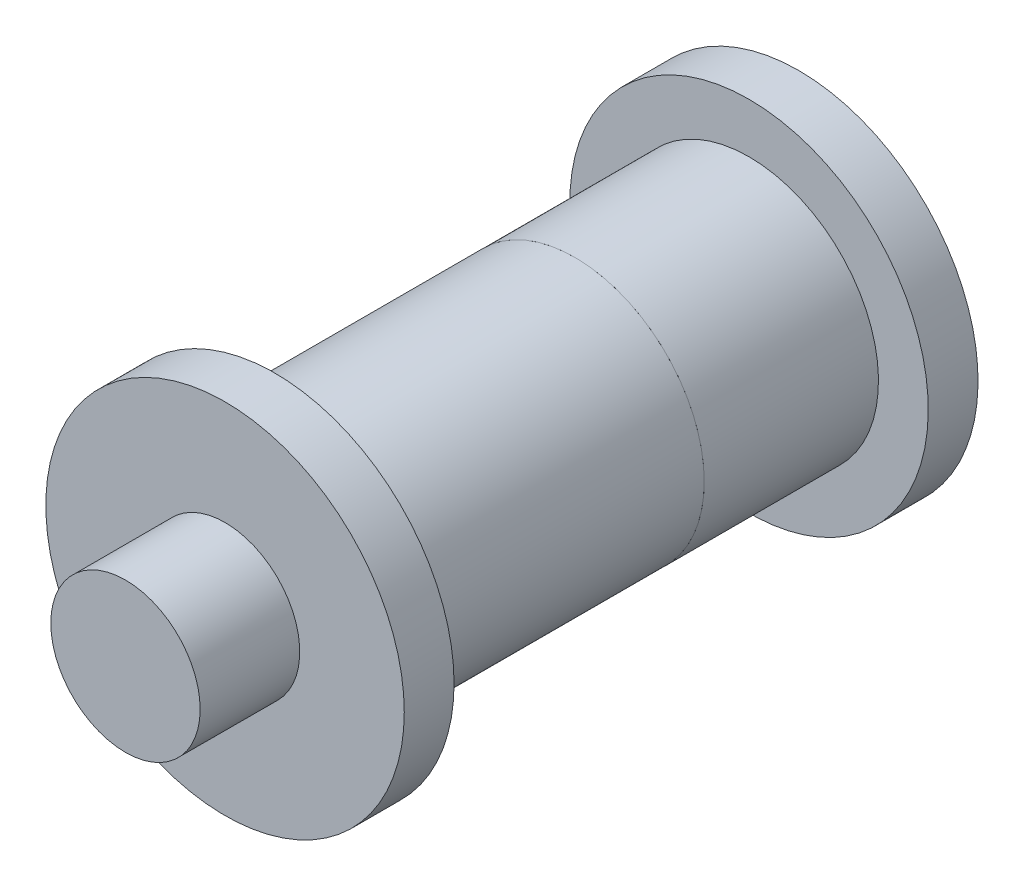
ISO-10303-21;
HEADER;
FILE_DESCRIPTION(('STEP AP214'),'2;1');
FILE_NAME('part.step','',(''),(''),'','','');
FILE_SCHEMA(('AUTOMOTIVE_DESIGN { 1 0 10303 214 1 1 1 1 }'));
ENDSEC;
DATA;
#1=APPLICATION_CONTEXT('core data for automotive mechanical design processes');
#2=APPLICATION_PROTOCOL_DEFINITION('international standard','automotive_design',2000,#1);
#3=PRODUCT_CONTEXT('',#1,'mechanical');
#4=PRODUCT('Part','Part','',(#3));
#5=PRODUCT_RELATED_PRODUCT_CATEGORY('part','',(#4));
#6=PRODUCT_DEFINITION_FORMATION('','',#4);
#7=PRODUCT_DEFINITION_CONTEXT('part definition',#1,'design');
#8=PRODUCT_DEFINITION('design','',#6,#7);
#9=PRODUCT_DEFINITION_SHAPE('','',#8);
#10=(LENGTH_UNIT() NAMED_UNIT(*) SI_UNIT(.MILLI.,.METRE.));
#11=(NAMED_UNIT(*) PLANE_ANGLE_UNIT() SI_UNIT($,.RADIAN.));
#12=(NAMED_UNIT(*) SI_UNIT($,.STERADIAN.) SOLID_ANGLE_UNIT());
#13=UNCERTAINTY_MEASURE_WITH_UNIT(LENGTH_MEASURE(1.E-05),#10,'distance_accuracy_value','');
#14=(GEOMETRIC_REPRESENTATION_CONTEXT(3) GLOBAL_UNCERTAINTY_ASSIGNED_CONTEXT((#13)) GLOBAL_UNIT_ASSIGNED_CONTEXT((#10,
#11,#12)) REPRESENTATION_CONTEXT('',''));
#15=CARTESIAN_POINT('',(0.,0.,0.));
#16=DIRECTION('',(0.,0.,1.));
#17=DIRECTION('',(1.,0.,0.));
#18=AXIS2_PLACEMENT_3D('',#15,#16,#17);
#19=CARTESIAN_POINT('',(0.,0.,0.));
#20=DIRECTION('',(0.,0.,1.));
#21=DIRECTION('',(1.,0.,0.));
#22=AXIS2_PLACEMENT_3D('',#19,#20,#21);
#23=PLANE('',#22);
#24=DIRECTION('',(-1.,0.,0.));
#25=VECTOR('',#24,1.);
#26=CARTESIAN_POINT('',(0.,1.1,0.));
#27=LINE('',#26,#25);
#28=CARTESIAN_POINT('',(1.16189500386223,1.1,0.));
#29=VERTEX_POINT('',#28);
#30=CARTESIAN_POINT('',(-1.16189500386223,1.1,0.));
#31=VERTEX_POINT('',#30);
#32=EDGE_CURVE('E75',#29,#31,#27,.T.);
#33=ORIENTED_EDGE('',*,*,#32,.T.);
#34=CARTESIAN_POINT('',(0.,0.,0.));
#35=DIRECTION('',(0.,0.,1.));
#36=DIRECTION('',(1.,0.,0.));
#37=AXIS2_PLACEMENT_3D('',#34,#35,#36);
#38=CIRCLE('',#37,1.6);
#39=EDGE_CURVE('E104',#31,#29,#38,.T.);
#40=ORIENTED_EDGE('',*,*,#39,.T.);
#41=EDGE_LOOP('',(#33,#40));
#42=FACE_BOUND('',#41,.T.);
#43=CARTESIAN_POINT('',(0.,0.,0.));
#44=DIRECTION('',(0.,0.,1.));
#45=DIRECTION('',(1.,0.,0.));
#46=AXIS2_PLACEMENT_3D('',#43,#44,#45);
#47=CIRCLE('',#46,5.2);
#48=CARTESIAN_POINT('',(5.2,0.,0.));
#49=VERTEX_POINT('',#48);
#50=EDGE_CURVE('E63',#49,#49,#47,.T.);
#51=ORIENTED_EDGE('',*,*,#50,.F.);
#52=EDGE_LOOP('',(#51));
#53=FACE_BOUND('',#52,.T.);
#54=ADVANCED_FACE('F55',(#42,#53),#23,.F.);
#55=CARTESIAN_POINT('',(0.,0.,14.05));
#56=DIRECTION('',(0.,0.,1.));
#57=DIRECTION('',(1.,0.,0.));
#58=AXIS2_PLACEMENT_3D('',#55,#56,#57);
#59=CYLINDRICAL_SURFACE('',#58,5.2);
#60=CARTESIAN_POINT('',(0.,0.,12.05));
#61=DIRECTION('',(0.,0.,1.));
#62=DIRECTION('',(1.,0.,0.));
#63=AXIS2_PLACEMENT_3D('',#60,#61,#62);
#64=CIRCLE('',#63,5.2);
#65=CARTESIAN_POINT('',(5.2,0.,12.05));
#66=VERTEX_POINT('',#65);
#67=EDGE_CURVE('E115',#66,#66,#64,.T.);
#68=ORIENTED_EDGE('',*,*,#67,.F.);
#69=EDGE_LOOP('',(#68));
#70=FACE_BOUND('',#69,.T.);
#71=ORIENTED_EDGE('',*,*,#50,.T.);
#72=EDGE_LOOP('',(#71));
#73=FACE_BOUND('',#72,.T.);
#74=ADVANCED_FACE('F122',(#70,#73),#59,.T.);
#75=CARTESIAN_POINT('',(0.,5.2,12.05));
#76=DIRECTION('',(0.,0.,1.));
#77=DIRECTION('',(1.,0.,0.));
#78=AXIS2_PLACEMENT_3D('',#75,#76,#77);
#79=PLANE('',#78);
#80=CARTESIAN_POINT('',(0.,0.,12.05));
#81=DIRECTION('',(0.,0.,1.));
#82=DIRECTION('',(1.,0.,0.));
#83=AXIS2_PLACEMENT_3D('',#80,#81,#82);
#84=CIRCLE('',#83,7.2);
#85=CARTESIAN_POINT('',(7.2,0.,12.05));
#86=VERTEX_POINT('',#85);
#87=EDGE_CURVE('E111',#86,#86,#84,.T.);
#88=ORIENTED_EDGE('',*,*,#87,.F.);
#89=EDGE_LOOP('',(#88));
#90=FACE_BOUND('',#89,.T.);
#91=ORIENTED_EDGE('',*,*,#67,.T.);
#92=EDGE_LOOP('',(#91));
#93=FACE_BOUND('',#92,.T.);
#94=ADVANCED_FACE('F129',(#90,#93),#79,.F.);
#95=CARTESIAN_POINT('',(0.,0.,14.05));
#96=DIRECTION('',(0.,0.,1.));
#97=DIRECTION('',(1.,0.,0.));
#98=AXIS2_PLACEMENT_3D('',#95,#96,#97);
#99=CYLINDRICAL_SURFACE('',#98,7.2);
#100=CARTESIAN_POINT('',(0.,0.,14.05));
#101=DIRECTION('',(0.,0.,1.));
#102=DIRECTION('',(1.,0.,0.));
#103=AXIS2_PLACEMENT_3D('',#100,#101,#102);
#104=CIRCLE('',#103,7.2);
#105=CARTESIAN_POINT('',(7.2,0.,14.05));
#106=VERTEX_POINT('',#105);
#107=EDGE_CURVE('E107',#106,#106,#104,.T.);
#108=ORIENTED_EDGE('',*,*,#107,.F.);
#109=EDGE_LOOP('',(#108));
#110=FACE_BOUND('',#109,.T.);
#111=ORIENTED_EDGE('',*,*,#87,.T.);
#112=EDGE_LOOP('',(#111));
#113=FACE_BOUND('',#112,.T.);
#114=ADVANCED_FACE('F134',(#110,#113),#99,.T.);
#115=CARTESIAN_POINT('',(0.,7.2,14.05));
#116=DIRECTION('',(0.,0.,-1.));
#117=DIRECTION('',(-1.,0.,0.));
#118=AXIS2_PLACEMENT_3D('',#115,#116,#117);
#119=PLANE('',#118);
#120=CARTESIAN_POINT('',(0.,0.,14.05));
#121=DIRECTION('',(0.,0.,-1.));
#122=DIRECTION('',(-1.,0.,0.));
#123=AXIS2_PLACEMENT_3D('',#120,#121,#122);
#124=CIRCLE('',#123,3.);
#125=CARTESIAN_POINT('',(-3.,0.,14.05));
#126=VERTEX_POINT('',#125);
#127=EDGE_CURVE('E12',#126,#126,#124,.F.);
#128=ORIENTED_EDGE('',*,*,#127,.F.);
#129=EDGE_LOOP('',(#128));
#130=FACE_BOUND('',#129,.T.);
#131=ORIENTED_EDGE('',*,*,#107,.T.);
#132=EDGE_LOOP('',(#131));
#133=FACE_BOUND('',#132,.T.);
#134=ADVANCED_FACE('F141',(#130,#133),#119,.F.);
#135=CARTESIAN_POINT('',(0.,0.,-11.));
#136=DIRECTION('',(0.,0.,1.));
#137=DIRECTION('',(1.,0.,0.));
#138=AXIS2_PLACEMENT_3D('',#135,#136,#137);
#139=CYLINDRICAL_SURFACE('',#138,1.6);
#140=DIRECTION('',(0.,0.,1.));
#141=VECTOR('',#140,1.);
#142=CARTESIAN_POINT('',(-1.16189500386223,1.1,-11.));
#143=LINE('',#142,#141);
#144=CARTESIAN_POINT('',(-1.16189500386223,1.1,14.05));
#145=VERTEX_POINT('',#144);
#146=EDGE_CURVE('E70',#31,#145,#143,.T.);
#147=ORIENTED_EDGE('',*,*,#146,.T.);
#148=CARTESIAN_POINT('',(0.,0.,14.05));
#149=DIRECTION('',(0.,0.,1.));
#150=DIRECTION('',(1.,0.,0.));
#151=AXIS2_PLACEMENT_3D('',#148,#149,#150);
#152=CIRCLE('',#151,1.6);
#153=CARTESIAN_POINT('',(1.16189500386222,1.1,14.05));
#154=VERTEX_POINT('',#153);
#155=EDGE_CURVE('E86',#145,#154,#152,.T.);
#156=ORIENTED_EDGE('',*,*,#155,.T.);
#157=DIRECTION('',(0.,0.,1.));
#158=VECTOR('',#157,1.);
#159=CARTESIAN_POINT('',(1.16189500386223,1.1,-11.));
#160=LINE('',#159,#158);
#161=EDGE_CURVE('E88',#29,#154,#160,.T.);
#162=ORIENTED_EDGE('',*,*,#161,.F.);
#163=ORIENTED_EDGE('',*,*,#39,.F.);
#164=EDGE_LOOP('',(#147,#156,#162,#163));
#165=FACE_BOUND('',#164,.T.);
#166=ADVANCED_FACE('F91',(#165),#139,.F.);
#167=CARTESIAN_POINT('',(-1.16189500386223,1.1,-11.));
#168=DIRECTION('',(0.,1.,0.));
#169=DIRECTION('',(0.,0.,1.));
#170=AXIS2_PLACEMENT_3D('',#167,#168,#169);
#171=PLANE('',#170);
#172=ORIENTED_EDGE('',*,*,#161,.T.);
#173=DIRECTION('',(-1.,0.,0.));
#174=VECTOR('',#173,1.);
#175=CARTESIAN_POINT('',(-1.16189500386223,1.1,14.05));
#176=LINE('',#175,#174);
#177=EDGE_CURVE('E83',#154,#145,#176,.T.);
#178=ORIENTED_EDGE('',*,*,#177,.T.);
#179=ORIENTED_EDGE('',*,*,#146,.F.);
#180=ORIENTED_EDGE('',*,*,#32,.F.);
#181=EDGE_LOOP('',(#172,#178,#179,#180));
#182=FACE_BOUND('',#181,.T.);
#183=ADVANCED_FACE('F96',(#182),#171,.F.);
#184=CARTESIAN_POINT('',(0.,0.,14.05));
#185=DIRECTION('',(0.,0.,1.));
#186=DIRECTION('',(1.,0.,0.));
#187=AXIS2_PLACEMENT_3D('',#184,#185,#186);
#188=PLANE('',#187);
#189=ORIENTED_EDGE('',*,*,#177,.F.);
#190=ORIENTED_EDGE('',*,*,#155,.F.);
#191=EDGE_LOOP('',(#189,#190));
#192=FACE_BOUND('',#191,.T.);
#193=ADVANCED_FACE('F85',(#192),#188,.F.);
#194=CARTESIAN_POINT('',(0.,0.,18.05));
#195=DIRECTION('',(0.,0.,-1.));
#196=DIRECTION('',(-1.,0.,0.));
#197=AXIS2_PLACEMENT_3D('',#194,#195,#196);
#198=CYLINDRICAL_SURFACE('',#197,3.);
#199=CARTESIAN_POINT('',(0.,0.,18.05));
#200=DIRECTION('',(0.,0.,1.));
#201=DIRECTION('',(1.,0.,0.));
#202=AXIS2_PLACEMENT_3D('',#199,#200,#201);
#203=CIRCLE('',#202,3.);
#204=CARTESIAN_POINT('',(3.,0.,18.05));
#205=VERTEX_POINT('',#204);
#206=EDGE_CURVE('E94',#205,#205,#203,.T.);
#207=ORIENTED_EDGE('',*,*,#206,.F.);
#208=EDGE_LOOP('',(#207));
#209=FACE_BOUND('',#208,.T.);
#210=ORIENTED_EDGE('',*,*,#127,.T.);
#211=EDGE_LOOP('',(#210));
#212=FACE_BOUND('',#211,.T.);
#213=ADVANCED_FACE('F150',(#209,#212),#198,.T.);
#214=CARTESIAN_POINT('',(0.,0.,18.05));
#215=DIRECTION('',(0.,0.,1.));
#216=DIRECTION('',(1.,0.,0.));
#217=AXIS2_PLACEMENT_3D('',#214,#215,#216);
#218=PLANE('',#217);
#219=ORIENTED_EDGE('',*,*,#206,.T.);
#220=EDGE_LOOP('',(#219));
#221=FACE_BOUND('',#220,.T.);
#222=ADVANCED_FACE('F153',(#221),#218,.T.);
#223=CLOSED_SHELL('',(#54,#74,#94,#114,#134,#166,#183,#193,#213,#222));
#224=MANIFOLD_SOLID_BREP('B2',#223);
#225=CARTESIAN_POINT('',(0.,0.,0.));
#226=DIRECTION('',(0.,0.,1.));
#227=DIRECTION('',(0.,-1.,0.));
#228=AXIS2_PLACEMENT_3D('',#225,#226,#227);
#229=PLANE('',#228);
#230=CARTESIAN_POINT('',(0.,0.,0.));
#231=DIRECTION('',(0.,0.,1.));
#232=DIRECTION('',(0.,-1.,0.));
#233=AXIS2_PLACEMENT_3D('',#230,#231,#232);
#234=CIRCLE('',#233,1.6);
#235=CARTESIAN_POINT('',(-1.16189500386223,1.1,0.));
#236=VERTEX_POINT('',#235);
#237=CARTESIAN_POINT('',(1.16189500386223,1.1,0.));
#238=VERTEX_POINT('',#237);
#239=EDGE_CURVE('E277',#236,#238,#234,.T.);
#240=ORIENTED_EDGE('',*,*,#239,.F.);
#241=DIRECTION('',(-1.,0.,0.));
#242=VECTOR('',#241,1.);
#243=CARTESIAN_POINT('',(0.,1.1,0.));
#244=LINE('',#243,#242);
#245=EDGE_CURVE('E273',#238,#236,#244,.T.);
#246=ORIENTED_EDGE('',*,*,#245,.F.);
#247=EDGE_LOOP('',(#240,#246));
#248=FACE_BOUND('',#247,.T.);
#249=CARTESIAN_POINT('',(0.,0.,0.));
#250=DIRECTION('',(0.,0.,-1.));
#251=DIRECTION('',(0.,1.,0.));
#252=AXIS2_PLACEMENT_3D('',#249,#250,#251);
#253=CIRCLE('',#252,5.2);
#254=CARTESIAN_POINT('',(0.,5.2,0.));
#255=VERTEX_POINT('',#254);
#256=EDGE_CURVE('E256',#255,#255,#253,.T.);
#257=ORIENTED_EDGE('',*,*,#256,.F.);
#258=EDGE_LOOP('',(#257));
#259=FACE_BOUND('',#258,.T.);
#260=ADVANCED_FACE('F249',(#248,#259),#229,.T.);
#261=CARTESIAN_POINT('',(0.,0.,-11.));
#262=DIRECTION('',(0.,0.,-1.));
#263=DIRECTION('',(0.,1.,0.));
#264=AXIS2_PLACEMENT_3D('',#261,#262,#263);
#265=CYLINDRICAL_SURFACE('',#264,5.2);
#266=ORIENTED_EDGE('',*,*,#256,.T.);
#267=EDGE_LOOP('',(#266));
#268=FACE_BOUND('',#267,.T.);
#269=CARTESIAN_POINT('',(0.,0.,-7.));
#270=DIRECTION('',(0.,0.,-1.));
#271=DIRECTION('',(0.,1.,0.));
#272=AXIS2_PLACEMENT_3D('',#269,#270,#271);
#273=CIRCLE('',#272,5.2);
#274=CARTESIAN_POINT('',(0.,5.2,-7.));
#275=VERTEX_POINT('',#274);
#276=EDGE_CURVE('E306',#275,#275,#273,.T.);
#277=ORIENTED_EDGE('',*,*,#276,.F.);
#278=EDGE_LOOP('',(#277));
#279=FACE_BOUND('',#278,.T.);
#280=ADVANCED_FACE('F311',(#268,#279),#265,.T.);
#281=CARTESIAN_POINT('',(0.,5.2,-7.));
#282=DIRECTION('',(0.,0.,1.));
#283=DIRECTION('',(0.,-1.,0.));
#284=AXIS2_PLACEMENT_3D('',#281,#282,#283);
#285=PLANE('',#284);
#286=ORIENTED_EDGE('',*,*,#276,.T.);
#287=EDGE_LOOP('',(#286));
#288=FACE_BOUND('',#287,.T.);
#289=CARTESIAN_POINT('',(0.,0.,-7.));
#290=DIRECTION('',(0.,0.,-1.));
#291=DIRECTION('',(0.,1.,0.));
#292=AXIS2_PLACEMENT_3D('',#289,#290,#291);
#293=CIRCLE('',#292,7.2);
#294=CARTESIAN_POINT('',(0.,7.2,-7.));
#295=VERTEX_POINT('',#294);
#296=EDGE_CURVE('E303',#295,#295,#293,.T.);
#297=ORIENTED_EDGE('',*,*,#296,.F.);
#298=EDGE_LOOP('',(#297));
#299=FACE_BOUND('',#298,.T.);
#300=ADVANCED_FACE('F317',(#288,#299),#285,.T.);
#301=CARTESIAN_POINT('',(0.,0.,-11.));
#302=DIRECTION('',(0.,0.,-1.));
#303=DIRECTION('',(0.,1.,0.));
#304=AXIS2_PLACEMENT_3D('',#301,#302,#303);
#305=CYLINDRICAL_SURFACE('',#304,7.2);
#306=ORIENTED_EDGE('',*,*,#296,.T.);
#307=EDGE_LOOP('',(#306));
#308=FACE_BOUND('',#307,.T.);
#309=CARTESIAN_POINT('',(0.,0.,-9.));
#310=DIRECTION('',(0.,0.,-1.));
#311=DIRECTION('',(0.,1.,0.));
#312=AXIS2_PLACEMENT_3D('',#309,#310,#311);
#313=CIRCLE('',#312,7.2);
#314=CARTESIAN_POINT('',(0.,7.2,-9.));
#315=VERTEX_POINT('',#314);
#316=EDGE_CURVE('E300',#315,#315,#313,.T.);
#317=ORIENTED_EDGE('',*,*,#316,.F.);
#318=EDGE_LOOP('',(#317));
#319=FACE_BOUND('',#318,.T.);
#320=ADVANCED_FACE('F321',(#308,#319),#305,.T.);
#321=CARTESIAN_POINT('',(0.,7.2,-9.));
#322=DIRECTION('',(0.,0.,-1.));
#323=DIRECTION('',(0.,1.,0.));
#324=AXIS2_PLACEMENT_3D('',#321,#322,#323);
#325=PLANE('',#324);
#326=ORIENTED_EDGE('',*,*,#316,.T.);
#327=EDGE_LOOP('',(#326));
#328=FACE_BOUND('',#327,.T.);
#329=CARTESIAN_POINT('',(0.,0.,-9.));
#330=DIRECTION('',(0.,0.,-1.));
#331=DIRECTION('',(0.,1.,0.));
#332=AXIS2_PLACEMENT_3D('',#329,#330,#331);
#333=CIRCLE('',#332,2.5);
#334=CARTESIAN_POINT('',(0.,2.5,-9.));
#335=VERTEX_POINT('',#334);
#336=EDGE_CURVE('E297',#335,#335,#333,.T.);
#337=ORIENTED_EDGE('',*,*,#336,.F.);
#338=EDGE_LOOP('',(#337));
#339=FACE_BOUND('',#338,.T.);
#340=ADVANCED_FACE('F327',(#328,#339),#325,.T.);
#341=CARTESIAN_POINT('',(0.,0.,-11.));
#342=DIRECTION('',(0.,0.,-1.));
#343=DIRECTION('',(0.,1.,0.));
#344=AXIS2_PLACEMENT_3D('',#341,#342,#343);
#345=CYLINDRICAL_SURFACE('',#344,2.5);
#346=ORIENTED_EDGE('',*,*,#336,.T.);
#347=EDGE_LOOP('',(#346));
#348=FACE_BOUND('',#347,.T.);
#349=CARTESIAN_POINT('',(0.,0.,-11.));
#350=DIRECTION('',(0.,0.,-1.));
#351=DIRECTION('',(0.,1.,0.));
#352=AXIS2_PLACEMENT_3D('',#349,#350,#351);
#353=CIRCLE('',#352,2.5);
#354=CARTESIAN_POINT('',(0.,2.5,-11.));
#355=VERTEX_POINT('',#354);
#356=EDGE_CURVE('E293',#355,#355,#353,.T.);
#357=ORIENTED_EDGE('',*,*,#356,.F.);
#358=EDGE_LOOP('',(#357));
#359=FACE_BOUND('',#358,.T.);
#360=ADVANCED_FACE('F331',(#348,#359),#345,.T.);
#361=CARTESIAN_POINT('',(0.,2.5,-11.));
#362=DIRECTION('',(0.,0.,-1.));
#363=DIRECTION('',(0.,1.,0.));
#364=AXIS2_PLACEMENT_3D('',#361,#362,#363);
#365=PLANE('',#364);
#366=CARTESIAN_POINT('',(0.,0.,-11.));
#367=DIRECTION('',(0.,0.,-1.));
#368=DIRECTION('',(0.,1.,0.));
#369=AXIS2_PLACEMENT_3D('',#366,#367,#368);
#370=CIRCLE('',#369,1.6);
#371=CARTESIAN_POINT('',(0.,1.6,-11.));
#372=VERTEX_POINT('',#371);
#373=EDGE_CURVE('E287',#372,#372,#370,.T.);
#374=ORIENTED_EDGE('',*,*,#373,.F.);
#375=EDGE_LOOP('',(#374));
#376=FACE_BOUND('',#375,.T.);
#377=ORIENTED_EDGE('',*,*,#356,.T.);
#378=EDGE_LOOP('',(#377));
#379=FACE_BOUND('',#378,.T.);
#380=ADVANCED_FACE('F335',(#376,#379),#365,.T.);
#381=CARTESIAN_POINT('',(0.,0.,-10.5));
#382=DIRECTION('',(0.,0.,-1.));
#383=DIRECTION('',(0.,1.,0.));
#384=AXIS2_PLACEMENT_3D('',#381,#382,#383);
#385=CYLINDRICAL_SURFACE('',#384,1.6);
#386=DIRECTION('',(0.,0.,1.));
#387=VECTOR('',#386,1.);
#388=CARTESIAN_POINT('',(1.16189500386223,1.1,-11.));
#389=LINE('',#388,#387);
#390=CARTESIAN_POINT('',(1.16189500386223,1.1,-10.5));
#391=VERTEX_POINT('',#390);
#392=EDGE_CURVE('E262',#391,#238,#389,.T.);
#393=ORIENTED_EDGE('',*,*,#392,.F.);
#394=CARTESIAN_POINT('',(0.,0.,-10.5));
#395=DIRECTION('',(0.,0.,-1.));
#396=DIRECTION('',(0.,1.,0.));
#397=AXIS2_PLACEMENT_3D('',#394,#395,#396);
#398=CIRCLE('',#397,1.6);
#399=CARTESIAN_POINT('',(-1.16189500386223,1.1,-10.5));
#400=VERTEX_POINT('',#399);
#401=EDGE_CURVE('E284',#400,#391,#398,.T.);
#402=ORIENTED_EDGE('',*,*,#401,.F.);
#403=DIRECTION('',(0.,0.,1.));
#404=VECTOR('',#403,1.);
#405=CARTESIAN_POINT('',(-1.16189500386223,1.1,-11.));
#406=LINE('',#405,#404);
#407=EDGE_CURVE('E267',#400,#236,#406,.T.);
#408=ORIENTED_EDGE('',*,*,#407,.T.);
#409=ORIENTED_EDGE('',*,*,#239,.T.);
#410=EDGE_LOOP('',(#393,#402,#408,#409));
#411=FACE_BOUND('',#410,.T.);
#412=ORIENTED_EDGE('',*,*,#373,.T.);
#413=EDGE_LOOP('',(#412));
#414=FACE_BOUND('',#413,.T.);
#415=ADVANCED_FACE('F281',(#411,#414),#385,.F.);
#416=CARTESIAN_POINT('',(0.,0.,-10.5));
#417=DIRECTION('',(0.,0.,-1.));
#418=DIRECTION('',(0.,1.,0.));
#419=AXIS2_PLACEMENT_3D('',#416,#417,#418);
#420=PLANE('',#419);
#421=DIRECTION('',(1.,0.,0.));
#422=VECTOR('',#421,1.);
#423=CARTESIAN_POINT('',(0.,1.1,-10.5));
#424=LINE('',#423,#422);
#425=EDGE_CURVE('E53',#400,#391,#424,.T.);
#426=ORIENTED_EDGE('',*,*,#425,.F.);
#427=ORIENTED_EDGE('',*,*,#401,.T.);
#428=EDGE_LOOP('',(#426,#427));
#429=FACE_BOUND('',#428,.T.);
#430=ADVANCED_FACE('F342',(#429),#420,.T.);
#431=CARTESIAN_POINT('',(-1.16189500386223,1.1,-11.));
#432=DIRECTION('',(0.,1.,0.));
#433=DIRECTION('',(0.,0.,1.));
#434=AXIS2_PLACEMENT_3D('',#431,#432,#433);
#435=PLANE('',#434);
#436=ORIENTED_EDGE('',*,*,#245,.T.);
#437=ORIENTED_EDGE('',*,*,#407,.F.);
#438=ORIENTED_EDGE('',*,*,#425,.T.);
#439=ORIENTED_EDGE('',*,*,#392,.T.);
#440=EDGE_LOOP('',(#436,#437,#438,#439));
#441=FACE_BOUND('',#440,.T.);
#442=ADVANCED_FACE('F274',(#441),#435,.F.);
#443=CLOSED_SHELL('',(#260,#280,#300,#320,#340,#360,#380,#415,#430,#442));
#444=MANIFOLD_SOLID_BREP('B6',#443);
#445=ADVANCED_BREP_SHAPE_REPRESENTATION('',(#18,#224,#444),#14);
#446=SHAPE_DEFINITION_REPRESENTATION(#9,#445);
ENDSEC;
END-ISO-10303-21;
